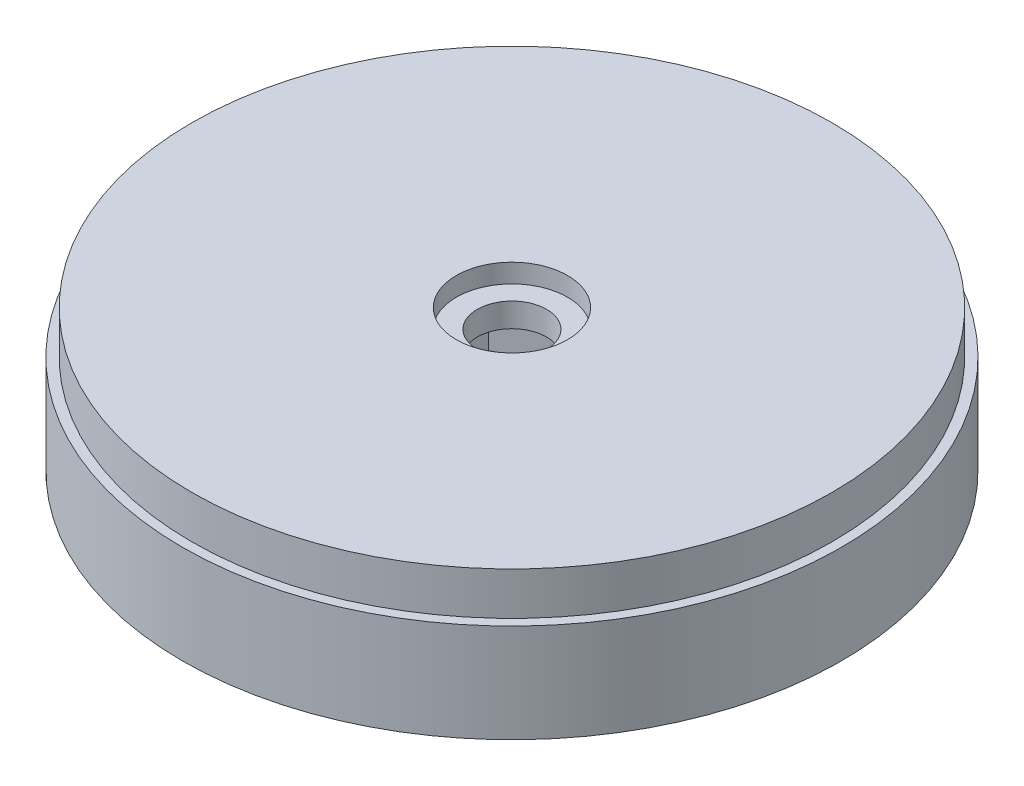
ISO-10303-21;
HEADER;
FILE_DESCRIPTION(('STEP AP214'),'2;1');
FILE_NAME('part.step','',(''),(''),'','','');
FILE_SCHEMA(('AUTOMOTIVE_DESIGN { 1 0 10303 214 1 1 1 1 }'));
ENDSEC;
DATA;
#1=APPLICATION_CONTEXT('core data for automotive mechanical design processes');
#2=APPLICATION_PROTOCOL_DEFINITION('international standard','automotive_design',2000,#1);
#3=PRODUCT_CONTEXT('',#1,'mechanical');
#4=PRODUCT('Part','Part','',(#3));
#5=PRODUCT_RELATED_PRODUCT_CATEGORY('part','',(#4));
#6=PRODUCT_DEFINITION_FORMATION('','',#4);
#7=PRODUCT_DEFINITION_CONTEXT('part definition',#1,'design');
#8=PRODUCT_DEFINITION('design','',#6,#7);
#9=PRODUCT_DEFINITION_SHAPE('','',#8);
#10=(LENGTH_UNIT() NAMED_UNIT(*) SI_UNIT(.MILLI.,.METRE.));
#11=(NAMED_UNIT(*) PLANE_ANGLE_UNIT() SI_UNIT($,.RADIAN.));
#12=(NAMED_UNIT(*) SI_UNIT($,.STERADIAN.) SOLID_ANGLE_UNIT());
#13=UNCERTAINTY_MEASURE_WITH_UNIT(LENGTH_MEASURE(1.E-05),#10,'distance_accuracy_value','');
#14=(GEOMETRIC_REPRESENTATION_CONTEXT(3) GLOBAL_UNCERTAINTY_ASSIGNED_CONTEXT((#13)) GLOBAL_UNIT_ASSIGNED_CONTEXT((#10,
#11,#12)) REPRESENTATION_CONTEXT('',''));
#15=CARTESIAN_POINT('',(0.,0.,0.));
#16=DIRECTION('',(0.,0.,1.));
#17=DIRECTION('',(1.,0.,0.));
#18=AXIS2_PLACEMENT_3D('',#15,#16,#17);
#19=CARTESIAN_POINT('',(0.,16.5,0.));
#20=DIRECTION('',(0.,-1.,0.));
#21=DIRECTION('',(0.,0.,-1.));
#22=AXIS2_PLACEMENT_3D('',#19,#20,#21);
#23=CYLINDRICAL_SURFACE('',#22,4.05);
#24=CARTESIAN_POINT('',(0.,11.5,0.));
#25=DIRECTION('',(0.,1.,0.));
#26=DIRECTION('',(0.,0.,1.));
#27=AXIS2_PLACEMENT_3D('',#24,#25,#26);
#28=CIRCLE('',#27,4.05);
#29=CARTESIAN_POINT('',(0.,11.5,4.05));
#30=VERTEX_POINT('',#29);
#31=EDGE_CURVE('E108',#30,#30,#28,.T.);
#32=ORIENTED_EDGE('',*,*,#31,.F.);
#33=EDGE_LOOP('',(#32));
#34=FACE_BOUND('',#33,.T.);
#35=CARTESIAN_POINT('',(0.,14.3,0.));
#36=DIRECTION('',(0.,1.,0.));
#37=DIRECTION('',(0.,0.,1.));
#38=AXIS2_PLACEMENT_3D('',#35,#36,#37);
#39=CIRCLE('',#38,4.05);
#40=CARTESIAN_POINT('',(0.,14.3,4.05));
#41=VERTEX_POINT('',#40);
#42=EDGE_CURVE('E43',#41,#41,#39,.T.);
#43=ORIENTED_EDGE('',*,*,#42,.T.);
#44=EDGE_LOOP('',(#43));
#45=FACE_BOUND('',#44,.T.);
#46=ADVANCED_FACE('F39',(#34,#45),#23,.F.);
#47=CARTESIAN_POINT('',(6.5,11.5,-3.75277674973257));
#48=DIRECTION('',(-0.5,0.,0.866025403784439));
#49=DIRECTION('',(0.866025403784439,0.,0.5));
#50=AXIS2_PLACEMENT_3D('',#47,#48,#49);
#51=PLANE('',#50);
#52=DIRECTION('',(0.,-1.,0.));
#53=VECTOR('',#52,1.);
#54=CARTESIAN_POINT('',(0.,11.5,-7.50555349946514));
#55=LINE('',#54,#53);
#56=CARTESIAN_POINT('',(0.,11.5,-7.50555349946514));
#57=VERTEX_POINT('',#56);
#58=CARTESIAN_POINT('',(0.,7.,-7.50555349946514));
#59=VERTEX_POINT('',#58);
#60=EDGE_CURVE('E106',#57,#59,#55,.T.);
#61=ORIENTED_EDGE('',*,*,#60,.T.);
#62=DIRECTION('',(0.866025403784439,0.,0.5));
#63=VECTOR('',#62,1.);
#64=CARTESIAN_POINT('',(6.5,7.,-3.75277674973257));
#65=LINE('',#64,#63);
#66=CARTESIAN_POINT('',(6.5,7.,-3.75277674973257));
#67=VERTEX_POINT('',#66);
#68=EDGE_CURVE('E93',#59,#67,#65,.T.);
#69=ORIENTED_EDGE('',*,*,#68,.T.);
#70=DIRECTION('',(0.,-1.,0.));
#71=VECTOR('',#70,1.);
#72=CARTESIAN_POINT('',(6.5,11.5,-3.75277674973257));
#73=LINE('',#72,#71);
#74=CARTESIAN_POINT('',(6.5,11.5,-3.75277674973257));
#75=VERTEX_POINT('',#74);
#76=EDGE_CURVE('E104',#75,#67,#73,.T.);
#77=ORIENTED_EDGE('',*,*,#76,.F.);
#78=DIRECTION('',(-0.866025403784439,0.,-0.5));
#79=VECTOR('',#78,1.);
#80=CARTESIAN_POINT('',(6.5,11.5,-3.75277674973257));
#81=LINE('',#80,#79);
#82=EDGE_CURVE('E227',#75,#57,#81,.T.);
#83=ORIENTED_EDGE('',*,*,#82,.T.);
#84=EDGE_LOOP('',(#61,#69,#77,#83));
#85=FACE_BOUND('',#84,.T.);
#86=ADVANCED_FACE('F102',(#85),#51,.T.);
#87=CARTESIAN_POINT('',(0.,11.5,-7.50555349946514));
#88=DIRECTION('',(0.5,0.,0.866025403784439));
#89=DIRECTION('',(0.866025403784439,0.,-0.5));
#90=AXIS2_PLACEMENT_3D('',#87,#88,#89);
#91=PLANE('',#90);
#92=DIRECTION('',(0.,-1.,0.));
#93=VECTOR('',#92,1.);
#94=CARTESIAN_POINT('',(-6.5,11.5,-3.75277674973257));
#95=LINE('',#94,#93);
#96=CARTESIAN_POINT('',(-6.5,11.5,-3.75277674973257));
#97=VERTEX_POINT('',#96);
#98=CARTESIAN_POINT('',(-6.5,7.,-3.75277674973257));
#99=VERTEX_POINT('',#98);
#100=EDGE_CURVE('E132',#97,#99,#95,.T.);
#101=ORIENTED_EDGE('',*,*,#100,.T.);
#102=DIRECTION('',(0.866025403784439,0.,-0.5));
#103=VECTOR('',#102,1.);
#104=CARTESIAN_POINT('',(0.,7.,-7.50555349946514));
#105=LINE('',#104,#103);
#106=EDGE_CURVE('E109',#99,#59,#105,.T.);
#107=ORIENTED_EDGE('',*,*,#106,.T.);
#108=ORIENTED_EDGE('',*,*,#60,.F.);
#109=DIRECTION('',(-0.866025403784439,0.,0.5));
#110=VECTOR('',#109,1.);
#111=CARTESIAN_POINT('',(0.,11.5,-7.50555349946514));
#112=LINE('',#111,#110);
#113=EDGE_CURVE('E205',#57,#97,#112,.T.);
#114=ORIENTED_EDGE('',*,*,#113,.T.);
#115=EDGE_LOOP('',(#101,#107,#108,#114));
#116=FACE_BOUND('',#115,.T.);
#117=ADVANCED_FACE('F167',(#116),#91,.T.);
#118=CARTESIAN_POINT('',(-6.5,11.5,-3.75277674973257));
#119=DIRECTION('',(1.,0.,0.));
#120=DIRECTION('',(0.,0.,-1.));
#121=AXIS2_PLACEMENT_3D('',#118,#119,#120);
#122=PLANE('',#121);
#123=DIRECTION('',(0.,-1.,0.));
#124=VECTOR('',#123,1.);
#125=CARTESIAN_POINT('',(-6.5,11.5,3.75277674973257));
#126=LINE('',#125,#124);
#127=CARTESIAN_POINT('',(-6.5,11.5,3.75277674973257));
#128=VERTEX_POINT('',#127);
#129=CARTESIAN_POINT('',(-6.5,7.,3.75277674973257));
#130=VERTEX_POINT('',#129);
#131=EDGE_CURVE('E128',#128,#130,#126,.T.);
#132=ORIENTED_EDGE('',*,*,#131,.T.);
#133=DIRECTION('',(0.,0.,-1.));
#134=VECTOR('',#133,1.);
#135=CARTESIAN_POINT('',(-6.5,7.,-3.75277674973257));
#136=LINE('',#135,#134);
#137=EDGE_CURVE('E209',#130,#99,#136,.T.);
#138=ORIENTED_EDGE('',*,*,#137,.T.);
#139=ORIENTED_EDGE('',*,*,#100,.F.);
#140=DIRECTION('',(0.,0.,1.));
#141=VECTOR('',#140,1.);
#142=CARTESIAN_POINT('',(-6.5,11.5,-3.75277674973257));
#143=LINE('',#142,#141);
#144=EDGE_CURVE('E207',#97,#128,#143,.T.);
#145=ORIENTED_EDGE('',*,*,#144,.T.);
#146=EDGE_LOOP('',(#132,#138,#139,#145));
#147=FACE_BOUND('',#146,.T.);
#148=ADVANCED_FACE('F194',(#147),#122,.T.);
#149=CARTESIAN_POINT('',(-6.5,11.5,3.75277674973257));
#150=DIRECTION('',(0.5,0.,-0.866025403784439));
#151=DIRECTION('',(-0.866025403784439,0.,-0.5));
#152=AXIS2_PLACEMENT_3D('',#149,#150,#151);
#153=PLANE('',#152);
#154=DIRECTION('',(0.,-1.,0.));
#155=VECTOR('',#154,1.);
#156=CARTESIAN_POINT('',(0.,11.5,7.50555349946514));
#157=LINE('',#156,#155);
#158=CARTESIAN_POINT('',(0.,11.5,7.50555349946514));
#159=VERTEX_POINT('',#158);
#160=CARTESIAN_POINT('',(0.,7.,7.50555349946514));
#161=VERTEX_POINT('',#160);
#162=EDGE_CURVE('E119',#159,#161,#157,.T.);
#163=ORIENTED_EDGE('',*,*,#162,.T.);
#164=DIRECTION('',(-0.866025403784439,0.,-0.5));
#165=VECTOR('',#164,1.);
#166=CARTESIAN_POINT('',(-6.5,7.,3.75277674973257));
#167=LINE('',#166,#165);
#168=EDGE_CURVE('E212',#161,#130,#167,.T.);
#169=ORIENTED_EDGE('',*,*,#168,.T.);
#170=ORIENTED_EDGE('',*,*,#131,.F.);
#171=DIRECTION('',(0.866025403784439,0.,0.5));
#172=VECTOR('',#171,1.);
#173=CARTESIAN_POINT('',(-6.5,11.5,3.75277674973257));
#174=LINE('',#173,#172);
#175=EDGE_CURVE('E63',#128,#159,#174,.T.);
#176=ORIENTED_EDGE('',*,*,#175,.T.);
#177=EDGE_LOOP('',(#163,#169,#170,#176));
#178=FACE_BOUND('',#177,.T.);
#179=ADVANCED_FACE('F190',(#178),#153,.T.);
#180=CARTESIAN_POINT('',(0.,11.5,7.50555349946514));
#181=DIRECTION('',(-0.5,0.,-0.866025403784439));
#182=DIRECTION('',(-0.866025403784439,0.,0.5));
#183=AXIS2_PLACEMENT_3D('',#180,#181,#182);
#184=PLANE('',#183);
#185=DIRECTION('',(0.,-1.,0.));
#186=VECTOR('',#185,1.);
#187=CARTESIAN_POINT('',(6.5,11.5,3.75277674973257));
#188=LINE('',#187,#186);
#189=CARTESIAN_POINT('',(6.5,11.5,3.75277674973257));
#190=VERTEX_POINT('',#189);
#191=CARTESIAN_POINT('',(6.5,7.,3.75277674973257));
#192=VERTEX_POINT('',#191);
#193=EDGE_CURVE('E115',#190,#192,#188,.T.);
#194=ORIENTED_EDGE('',*,*,#193,.T.);
#195=DIRECTION('',(-0.866025403784439,0.,0.5));
#196=VECTOR('',#195,1.);
#197=CARTESIAN_POINT('',(0.,7.,7.50555349946514));
#198=LINE('',#197,#196);
#199=EDGE_CURVE('E56',#192,#161,#198,.T.);
#200=ORIENTED_EDGE('',*,*,#199,.T.);
#201=ORIENTED_EDGE('',*,*,#162,.F.);
#202=DIRECTION('',(0.866025403784439,0.,-0.5));
#203=VECTOR('',#202,1.);
#204=CARTESIAN_POINT('',(0.,11.5,7.50555349946514));
#205=LINE('',#204,#203);
#206=EDGE_CURVE('E121',#159,#190,#205,.T.);
#207=ORIENTED_EDGE('',*,*,#206,.T.);
#208=EDGE_LOOP('',(#194,#200,#201,#207));
#209=FACE_BOUND('',#208,.T.);
#210=ADVANCED_FACE('F187',(#209),#184,.T.);
#211=CARTESIAN_POINT('',(6.5,11.5,3.75277674973257));
#212=DIRECTION('',(-1.,0.,0.));
#213=DIRECTION('',(0.,0.,1.));
#214=AXIS2_PLACEMENT_3D('',#211,#212,#213);
#215=PLANE('',#214);
#216=ORIENTED_EDGE('',*,*,#76,.T.);
#217=DIRECTION('',(0.,0.,1.));
#218=VECTOR('',#217,1.);
#219=CARTESIAN_POINT('',(6.5,7.,3.75277674973257));
#220=LINE('',#219,#218);
#221=EDGE_CURVE('E11',#67,#192,#220,.T.);
#222=ORIENTED_EDGE('',*,*,#221,.T.);
#223=ORIENTED_EDGE('',*,*,#193,.F.);
#224=DIRECTION('',(0.,0.,-1.));
#225=VECTOR('',#224,1.);
#226=CARTESIAN_POINT('',(6.5,11.5,3.75277674973257));
#227=LINE('',#226,#225);
#228=EDGE_CURVE('E113',#190,#75,#227,.T.);
#229=ORIENTED_EDGE('',*,*,#228,.T.);
#230=EDGE_LOOP('',(#216,#222,#223,#229));
#231=FACE_BOUND('',#230,.T.);
#232=ADVANCED_FACE('F112',(#231),#215,.T.);
#233=CARTESIAN_POINT('',(0.,11.5,0.));
#234=DIRECTION('',(0.,1.,0.));
#235=DIRECTION('',(0.,0.,1.));
#236=AXIS2_PLACEMENT_3D('',#233,#234,#235);
#237=PLANE('',#236);
#238=CARTESIAN_POINT('',(0.,11.5,0.));
#239=DIRECTION('',(0.,1.,0.));
#240=DIRECTION('',(0.,0.,1.));
#241=AXIS2_PLACEMENT_3D('',#238,#239,#240);
#242=CIRCLE('',#241,37.4);
#243=CARTESIAN_POINT('',(0.,11.5,37.4));
#244=VERTEX_POINT('',#243);
#245=EDGE_CURVE('E49',#244,#244,#242,.T.);
#246=ORIENTED_EDGE('',*,*,#245,.F.);
#247=EDGE_LOOP('',(#246));
#248=FACE_BOUND('',#247,.T.);
#249=CARTESIAN_POINT('',(0.,11.5,0.));
#250=DIRECTION('',(0.,1.,0.));
#251=DIRECTION('',(0.,0.,1.));
#252=AXIS2_PLACEMENT_3D('',#249,#250,#251);
#253=CIRCLE('',#252,38.5);
#254=CARTESIAN_POINT('',(0.,11.5,38.5));
#255=VERTEX_POINT('',#254);
#256=EDGE_CURVE('E139',#255,#255,#253,.T.);
#257=ORIENTED_EDGE('',*,*,#256,.T.);
#258=EDGE_LOOP('',(#257));
#259=FACE_BOUND('',#258,.T.);
#260=ADVANCED_FACE('F150',(#248,#259),#237,.T.);
#261=CARTESIAN_POINT('',(0.,0.,0.));
#262=DIRECTION('',(0.,1.,0.));
#263=DIRECTION('',(0.,0.,1.));
#264=AXIS2_PLACEMENT_3D('',#261,#262,#263);
#265=PLANE('',#264);
#266=CARTESIAN_POINT('',(0.,0.,0.));
#267=DIRECTION('',(0.,-1.,0.));
#268=DIRECTION('',(0.,0.,-1.));
#269=AXIS2_PLACEMENT_3D('',#266,#267,#268);
#270=CIRCLE('',#269,8.);
#271=CARTESIAN_POINT('',(0.,0.,-8.));
#272=VERTEX_POINT('',#271);
#273=EDGE_CURVE('E246',#272,#272,#270,.T.);
#274=ORIENTED_EDGE('',*,*,#273,.F.);
#275=EDGE_LOOP('',(#274));
#276=FACE_BOUND('',#275,.T.);
#277=CARTESIAN_POINT('',(0.,0.,0.));
#278=DIRECTION('',(0.,1.,0.));
#279=DIRECTION('',(0.,0.,1.));
#280=AXIS2_PLACEMENT_3D('',#277,#278,#279);
#281=CIRCLE('',#280,38.5);
#282=CARTESIAN_POINT('',(0.,0.,38.5));
#283=VERTEX_POINT('',#282);
#284=EDGE_CURVE('E138',#283,#283,#281,.T.);
#285=ORIENTED_EDGE('',*,*,#284,.F.);
#286=EDGE_LOOP('',(#285));
#287=FACE_BOUND('',#286,.T.);
#288=ADVANCED_FACE('F148',(#276,#287),#265,.F.);
#289=CARTESIAN_POINT('',(0.,11.5,0.));
#290=DIRECTION('',(0.,-1.,0.));
#291=DIRECTION('',(0.,0.,-1.));
#292=AXIS2_PLACEMENT_3D('',#289,#290,#291);
#293=CYLINDRICAL_SURFACE('',#292,38.5);
#294=ORIENTED_EDGE('',*,*,#256,.F.);
#295=EDGE_LOOP('',(#294));
#296=FACE_BOUND('',#295,.T.);
#297=ORIENTED_EDGE('',*,*,#284,.T.);
#298=EDGE_LOOP('',(#297));
#299=FACE_BOUND('',#298,.T.);
#300=ADVANCED_FACE('F41',(#296,#299),#293,.T.);
#301=CARTESIAN_POINT('',(0.,16.5,0.));
#302=DIRECTION('',(0.,1.,0.));
#303=DIRECTION('',(0.,0.,1.));
#304=AXIS2_PLACEMENT_3D('',#301,#302,#303);
#305=PLANE('',#304);
#306=CARTESIAN_POINT('',(0.,16.5,0.));
#307=DIRECTION('',(0.,1.,0.));
#308=DIRECTION('',(0.,0.,1.));
#309=AXIS2_PLACEMENT_3D('',#306,#307,#308);
#310=CIRCLE('',#309,6.5);
#311=CARTESIAN_POINT('',(0.,16.5,6.5));
#312=VERTEX_POINT('',#311);
#313=EDGE_CURVE('E252',#312,#312,#310,.T.);
#314=ORIENTED_EDGE('',*,*,#313,.F.);
#315=EDGE_LOOP('',(#314));
#316=FACE_BOUND('',#315,.T.);
#317=CARTESIAN_POINT('',(0.,16.5,0.));
#318=DIRECTION('',(0.,1.,0.));
#319=DIRECTION('',(0.,0.,1.));
#320=AXIS2_PLACEMENT_3D('',#317,#318,#319);
#321=CIRCLE('',#320,37.4);
#322=CARTESIAN_POINT('',(0.,16.5,37.4));
#323=VERTEX_POINT('',#322);
#324=EDGE_CURVE('E223',#323,#323,#321,.T.);
#325=ORIENTED_EDGE('',*,*,#324,.T.);
#326=EDGE_LOOP('',(#325));
#327=FACE_BOUND('',#326,.T.);
#328=ADVANCED_FACE('F156',(#316,#327),#305,.T.);
#329=CARTESIAN_POINT('',(0.,11.5,0.));
#330=DIRECTION('',(0.,1.,0.));
#331=DIRECTION('',(0.,0.,1.));
#332=AXIS2_PLACEMENT_3D('',#329,#330,#331);
#333=PLANE('',#332);
#334=ORIENTED_EDGE('',*,*,#113,.F.);
#335=ORIENTED_EDGE('',*,*,#82,.F.);
#336=ORIENTED_EDGE('',*,*,#228,.F.);
#337=ORIENTED_EDGE('',*,*,#206,.F.);
#338=ORIENTED_EDGE('',*,*,#175,.F.);
#339=ORIENTED_EDGE('',*,*,#144,.F.);
#340=EDGE_LOOP('',(#334,#335,#336,#337,#338,#339));
#341=FACE_BOUND('',#340,.T.);
#342=ORIENTED_EDGE('',*,*,#31,.T.);
#343=EDGE_LOOP('',(#342));
#344=FACE_BOUND('',#343,.T.);
#345=ADVANCED_FACE('F177',(#341,#344),#333,.F.);
#346=CARTESIAN_POINT('',(0.,16.5,0.));
#347=DIRECTION('',(0.,-1.,0.));
#348=DIRECTION('',(0.,0.,-1.));
#349=AXIS2_PLACEMENT_3D('',#346,#347,#348);
#350=CYLINDRICAL_SURFACE('',#349,37.4);
#351=ORIENTED_EDGE('',*,*,#324,.F.);
#352=EDGE_LOOP('',(#351));
#353=FACE_BOUND('',#352,.T.);
#354=ORIENTED_EDGE('',*,*,#245,.T.);
#355=EDGE_LOOP('',(#354));
#356=FACE_BOUND('',#355,.T.);
#357=ADVANCED_FACE('F181',(#353,#356),#350,.T.);
#358=CARTESIAN_POINT('',(0.,7.,0.));
#359=DIRECTION('',(0.,-1.,0.));
#360=DIRECTION('',(0.,0.,-1.));
#361=AXIS2_PLACEMENT_3D('',#358,#359,#360);
#362=CYLINDRICAL_SURFACE('',#361,8.);
#363=CARTESIAN_POINT('',(0.,7.,0.));
#364=DIRECTION('',(0.,-1.,0.));
#365=DIRECTION('',(0.,0.,-1.));
#366=AXIS2_PLACEMENT_3D('',#363,#364,#365);
#367=CIRCLE('',#366,8.);
#368=CARTESIAN_POINT('',(0.,7.,-8.));
#369=VERTEX_POINT('',#368);
#370=EDGE_CURVE('E243',#369,#369,#367,.T.);
#371=ORIENTED_EDGE('',*,*,#370,.F.);
#372=EDGE_LOOP('',(#371));
#373=FACE_BOUND('',#372,.T.);
#374=ORIENTED_EDGE('',*,*,#273,.T.);
#375=EDGE_LOOP('',(#374));
#376=FACE_BOUND('',#375,.T.);
#377=ADVANCED_FACE('F173',(#373,#376),#362,.F.);
#378=CARTESIAN_POINT('',(0.,7.,0.));
#379=DIRECTION('',(0.,-1.,0.));
#380=DIRECTION('',(0.,0.,-1.));
#381=AXIS2_PLACEMENT_3D('',#378,#379,#380);
#382=PLANE('',#381);
#383=ORIENTED_EDGE('',*,*,#106,.F.);
#384=ORIENTED_EDGE('',*,*,#137,.F.);
#385=ORIENTED_EDGE('',*,*,#168,.F.);
#386=ORIENTED_EDGE('',*,*,#199,.F.);
#387=ORIENTED_EDGE('',*,*,#221,.F.);
#388=ORIENTED_EDGE('',*,*,#68,.F.);
#389=EDGE_LOOP('',(#383,#384,#385,#386,#387,#388));
#390=FACE_BOUND('',#389,.T.);
#391=ORIENTED_EDGE('',*,*,#370,.T.);
#392=EDGE_LOOP('',(#391));
#393=FACE_BOUND('',#392,.T.);
#394=ADVANCED_FACE('F91',(#390,#393),#382,.T.);
#395=CARTESIAN_POINT('',(0.,14.3,0.));
#396=DIRECTION('',(0.,1.,0.));
#397=DIRECTION('',(0.,0.,1.));
#398=AXIS2_PLACEMENT_3D('',#395,#396,#397);
#399=CYLINDRICAL_SURFACE('',#398,6.5);
#400=CARTESIAN_POINT('',(0.,14.3,0.));
#401=DIRECTION('',(0.,1.,0.));
#402=DIRECTION('',(0.,0.,1.));
#403=AXIS2_PLACEMENT_3D('',#400,#401,#402);
#404=CIRCLE('',#403,6.5);
#405=CARTESIAN_POINT('',(0.,14.3,6.5));
#406=VERTEX_POINT('',#405);
#407=EDGE_CURVE('E256',#406,#406,#404,.T.);
#408=ORIENTED_EDGE('',*,*,#407,.F.);
#409=EDGE_LOOP('',(#408));
#410=FACE_BOUND('',#409,.T.);
#411=ORIENTED_EDGE('',*,*,#313,.T.);
#412=EDGE_LOOP('',(#411));
#413=FACE_BOUND('',#412,.T.);
#414=ADVANCED_FACE('F267',(#410,#413),#399,.F.);
#415=CARTESIAN_POINT('',(0.,14.3,0.));
#416=DIRECTION('',(0.,1.,0.));
#417=DIRECTION('',(0.,0.,1.));
#418=AXIS2_PLACEMENT_3D('',#415,#416,#417);
#419=PLANE('',#418);
#420=ORIENTED_EDGE('',*,*,#42,.F.);
#421=EDGE_LOOP('',(#420));
#422=FACE_BOUND('',#421,.T.);
#423=ORIENTED_EDGE('',*,*,#407,.T.);
#424=EDGE_LOOP('',(#423));
#425=FACE_BOUND('',#424,.T.);
#426=ADVANCED_FACE('F265',(#422,#425),#419,.T.);
#427=CLOSED_SHELL('',(#46,#86,#117,#148,#179,#210,#232,#260,#288,#300,#328,#345,#357,#377,#394,
#414,#426));
#428=MANIFOLD_SOLID_BREP('B2',#427);
#429=ADVANCED_BREP_SHAPE_REPRESENTATION('',(#18,#428),#14);
#430=SHAPE_DEFINITION_REPRESENTATION(#9,#429);
ENDSEC;
END-ISO-10303-21;
